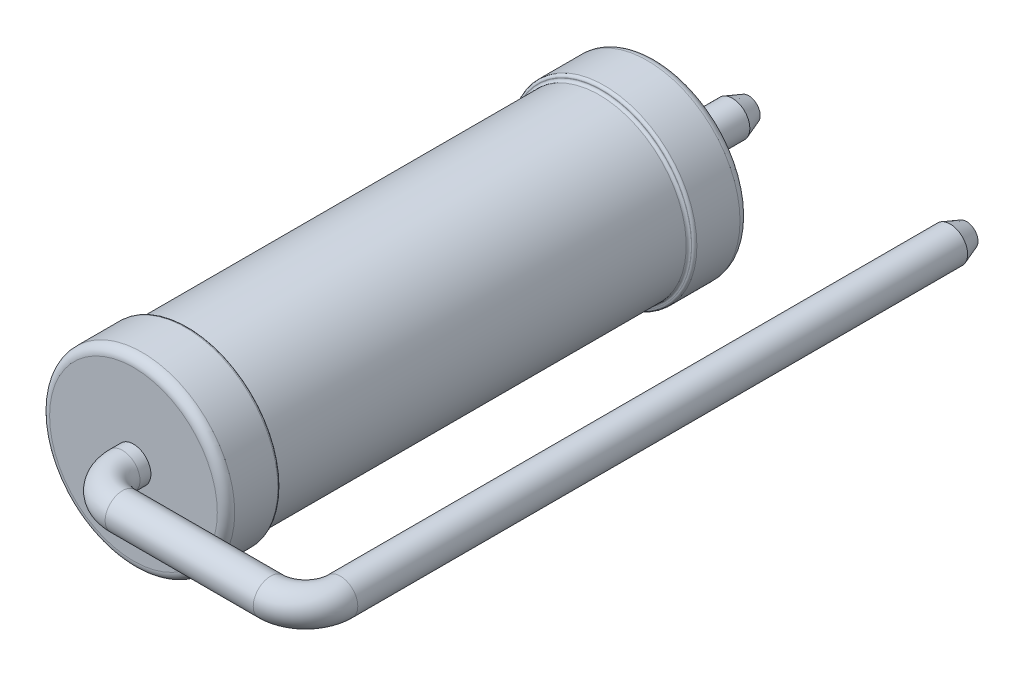
ISO-10303-21;
HEADER;
FILE_DESCRIPTION(('STEP AP214'),'2;1');
FILE_NAME('part.step','',(''),(''),'','','');
FILE_SCHEMA(('AUTOMOTIVE_DESIGN { 1 0 10303 214 1 1 1 1 }'));
ENDSEC;
DATA;
#1=APPLICATION_CONTEXT('core data for automotive mechanical design processes');
#2=APPLICATION_PROTOCOL_DEFINITION('international standard','automotive_design',2000,#1);
#3=PRODUCT_CONTEXT('',#1,'mechanical');
#4=PRODUCT('Part','Part','',(#3));
#5=PRODUCT_RELATED_PRODUCT_CATEGORY('part','',(#4));
#6=PRODUCT_DEFINITION_FORMATION('','',#4);
#7=PRODUCT_DEFINITION_CONTEXT('part definition',#1,'design');
#8=PRODUCT_DEFINITION('design','',#6,#7);
#9=PRODUCT_DEFINITION_SHAPE('','',#8);
#10=(LENGTH_UNIT() NAMED_UNIT(*) SI_UNIT(.MILLI.,.METRE.));
#11=(NAMED_UNIT(*) PLANE_ANGLE_UNIT() SI_UNIT($,.RADIAN.));
#12=(NAMED_UNIT(*) SI_UNIT($,.STERADIAN.) SOLID_ANGLE_UNIT());
#13=UNCERTAINTY_MEASURE_WITH_UNIT(LENGTH_MEASURE(1.E-05),#10,'distance_accuracy_value','');
#14=(GEOMETRIC_REPRESENTATION_CONTEXT(3) GLOBAL_UNCERTAINTY_ASSIGNED_CONTEXT((#13)) GLOBAL_UNIT_ASSIGNED_CONTEXT((#10,
#11,#12)) REPRESENTATION_CONTEXT('',''));
#15=CARTESIAN_POINT('',(0.,0.,0.));
#16=DIRECTION('',(0.,0.,1.));
#17=DIRECTION('',(1.,0.,0.));
#18=AXIS2_PLACEMENT_3D('',#15,#16,#17);
#19=CARTESIAN_POINT('',(-2.54,0.,12.446));
#20=DIRECTION('',(0.,0.,1.));
#21=DIRECTION('',(1.,0.,0.));
#22=AXIS2_PLACEMENT_3D('',#19,#20,#21);
#23=PLANE('',#22);
#24=CARTESIAN_POINT('',(-2.54,0.,12.446));
#25=DIRECTION('',(0.,0.,1.));
#26=DIRECTION('',(1.,0.,0.));
#27=AXIS2_PLACEMENT_3D('',#24,#25,#26);
#28=CIRCLE('',#27,0.4064);
#29=CARTESIAN_POINT('',(-2.1336,0.,12.446));
#30=VERTEX_POINT('',#29);
#31=EDGE_CURVE('E54',#30,#30,#28,.T.);
#32=ORIENTED_EDGE('',*,*,#31,.F.);
#33=EDGE_LOOP('',(#32));
#34=FACE_BOUND('',#33,.T.);
#35=CARTESIAN_POINT('',(-2.54,0.,12.446));
#36=DIRECTION('',(0.,0.,-1.));
#37=DIRECTION('',(-1.,0.,0.));
#38=AXIS2_PLACEMENT_3D('',#35,#36,#37);
#39=CIRCLE('',#38,1.9558);
#40=CARTESIAN_POINT('',(-4.4958,0.,12.446));
#41=VERTEX_POINT('',#40);
#42=EDGE_CURVE('E58',#41,#41,#39,.T.);
#43=ORIENTED_EDGE('',*,*,#42,.F.);
#44=EDGE_LOOP('',(#43));
#45=FACE_BOUND('',#44,.T.);
#46=ADVANCED_FACE('F34',(#34,#45),#23,.T.);
#47=CARTESIAN_POINT('',(-2.54,0.,12.2428));
#48=DIRECTION('',(0.,0.,-1.));
#49=DIRECTION('',(-1.,0.,0.));
#50=AXIS2_PLACEMENT_3D('',#47,#48,#49);
#51=TOROIDAL_SURFACE('',#50,1.9558,0.203200000000001);
#52=ORIENTED_EDGE('',*,*,#42,.T.);
#53=EDGE_LOOP('',(#52));
#54=FACE_BOUND('',#53,.T.);
#55=CARTESIAN_POINT('',(-2.54,0.,12.2428));
#56=DIRECTION('',(0.,0.,-1.));
#57=DIRECTION('',(-1.,0.,0.));
#58=AXIS2_PLACEMENT_3D('',#55,#56,#57);
#59=CIRCLE('',#58,2.159);
#60=CARTESIAN_POINT('',(-4.699,0.,12.2428));
#61=VERTEX_POINT('',#60);
#62=EDGE_CURVE('E62',#61,#61,#59,.T.);
#63=ORIENTED_EDGE('',*,*,#62,.F.);
#64=EDGE_LOOP('',(#63));
#65=FACE_BOUND('',#64,.T.);
#66=ADVANCED_FACE('F138',(#54,#65),#51,.T.);
#67=CARTESIAN_POINT('',(-2.54,0.,0.254));
#68=DIRECTION('',(0.,0.,-1.));
#69=DIRECTION('',(-1.,0.,0.));
#70=AXIS2_PLACEMENT_3D('',#67,#68,#69);
#71=CYLINDRICAL_SURFACE('',#70,2.159);
#72=ORIENTED_EDGE('',*,*,#62,.T.);
#73=EDGE_LOOP('',(#72));
#74=FACE_BOUND('',#73,.T.);
#75=CARTESIAN_POINT('',(-2.54,0.,11.23696));
#76=DIRECTION('',(0.,0.,-1.));
#77=DIRECTION('',(-1.,0.,0.));
#78=AXIS2_PLACEMENT_3D('',#75,#76,#77);
#79=CIRCLE('',#78,2.159);
#80=CARTESIAN_POINT('',(-4.699,0.,11.23696));
#81=VERTEX_POINT('',#80);
#82=EDGE_CURVE('E66',#81,#81,#79,.T.);
#83=ORIENTED_EDGE('',*,*,#82,.F.);
#84=EDGE_LOOP('',(#83));
#85=FACE_BOUND('',#84,.T.);
#86=ADVANCED_FACE('F144',(#74,#85),#71,.T.);
#87=CARTESIAN_POINT('',(-2.54,0.,11.23696));
#88=DIRECTION('',(0.,0.,-1.));
#89=DIRECTION('',(-1.,0.,0.));
#90=AXIS2_PLACEMENT_3D('',#87,#88,#89);
#91=TOROIDAL_SURFACE('',#90,2.09804,0.0609600000000001);
#92=ORIENTED_EDGE('',*,*,#82,.T.);
#93=EDGE_LOOP('',(#92));
#94=FACE_BOUND('',#93,.T.);
#95=CARTESIAN_POINT('',(-2.54,0.,11.176));
#96=DIRECTION('',(0.,0.,-1.));
#97=DIRECTION('',(-1.,0.,0.));
#98=AXIS2_PLACEMENT_3D('',#95,#96,#97);
#99=CIRCLE('',#98,2.09804);
#100=CARTESIAN_POINT('',(-4.63804,0.,11.176));
#101=VERTEX_POINT('',#100);
#102=EDGE_CURVE('E70',#101,#101,#99,.T.);
#103=ORIENTED_EDGE('',*,*,#102,.F.);
#104=EDGE_LOOP('',(#103));
#105=FACE_BOUND('',#104,.T.);
#106=ADVANCED_FACE('F323',(#94,#105),#91,.T.);
#107=CARTESIAN_POINT('',(-4.63804,0.,11.176));
#108=DIRECTION('',(0.,0.,-1.));
#109=DIRECTION('',(-1.,0.,0.));
#110=AXIS2_PLACEMENT_3D('',#107,#108,#109);
#111=PLANE('',#110);
#112=ORIENTED_EDGE('',*,*,#102,.T.);
#113=EDGE_LOOP('',(#112));
#114=FACE_BOUND('',#113,.T.);
#115=CARTESIAN_POINT('',(-2.54,0.,11.176));
#116=DIRECTION('',(0.,0.,-1.));
#117=DIRECTION('',(-1.,0.,0.));
#118=AXIS2_PLACEMENT_3D('',#115,#116,#117);
#119=CIRCLE('',#118,2.09296);
#120=CARTESIAN_POINT('',(-4.63296,0.,11.176));
#121=VERTEX_POINT('',#120);
#122=EDGE_CURVE('E74',#121,#121,#119,.T.);
#123=ORIENTED_EDGE('',*,*,#122,.F.);
#124=EDGE_LOOP('',(#123));
#125=FACE_BOUND('',#124,.T.);
#126=ADVANCED_FACE('F313',(#114,#125),#111,.T.);
#127=CARTESIAN_POINT('',(-2.54,0.,11.11504));
#128=DIRECTION('',(0.,0.,-1.));
#129=DIRECTION('',(-1.,0.,0.));
#130=AXIS2_PLACEMENT_3D('',#127,#128,#129);
#131=TOROIDAL_SURFACE('',#130,2.09296,0.060960000000001);
#132=ORIENTED_EDGE('',*,*,#122,.T.);
#133=EDGE_LOOP('',(#132));
#134=FACE_BOUND('',#133,.T.);
#135=CARTESIAN_POINT('',(-2.54,0.,11.11504));
#136=DIRECTION('',(0.,0.,-1.));
#137=DIRECTION('',(-1.,0.,0.));
#138=AXIS2_PLACEMENT_3D('',#135,#136,#137);
#139=CIRCLE('',#138,2.032);
#140=CARTESIAN_POINT('',(-4.572,0.,11.11504));
#141=VERTEX_POINT('',#140);
#142=EDGE_CURVE('E78',#141,#141,#139,.T.);
#143=ORIENTED_EDGE('',*,*,#142,.F.);
#144=EDGE_LOOP('',(#143));
#145=FACE_BOUND('',#144,.T.);
#146=ADVANCED_FACE('F303',(#134,#145),#131,.F.);
#147=CARTESIAN_POINT('',(-2.54,0.,0.254));
#148=DIRECTION('',(0.,0.,-1.));
#149=DIRECTION('',(-1.,0.,0.));
#150=AXIS2_PLACEMENT_3D('',#147,#148,#149);
#151=CYLINDRICAL_SURFACE('',#150,2.032);
#152=ORIENTED_EDGE('',*,*,#142,.T.);
#153=EDGE_LOOP('',(#152));
#154=FACE_BOUND('',#153,.T.);
#155=CARTESIAN_POINT('',(-2.54,0.,1.58496));
#156=DIRECTION('',(0.,0.,-1.));
#157=DIRECTION('',(-1.,0.,0.));
#158=AXIS2_PLACEMENT_3D('',#155,#156,#157);
#159=CIRCLE('',#158,2.032);
#160=CARTESIAN_POINT('',(-4.572,0.,1.58496));
#161=VERTEX_POINT('',#160);
#162=EDGE_CURVE('E82',#161,#161,#159,.T.);
#163=ORIENTED_EDGE('',*,*,#162,.F.);
#164=EDGE_LOOP('',(#163));
#165=FACE_BOUND('',#164,.T.);
#166=ADVANCED_FACE('F293',(#154,#165),#151,.T.);
#167=CARTESIAN_POINT('',(-2.54,0.,1.58496));
#168=DIRECTION('',(0.,0.,-1.));
#169=DIRECTION('',(-1.,0.,0.));
#170=AXIS2_PLACEMENT_3D('',#167,#168,#169);
#171=TOROIDAL_SURFACE('',#170,2.09296,0.0609599999999999);
#172=ORIENTED_EDGE('',*,*,#162,.T.);
#173=EDGE_LOOP('',(#172));
#174=FACE_BOUND('',#173,.T.);
#175=CARTESIAN_POINT('',(-2.54,0.,1.524));
#176=DIRECTION('',(0.,0.,-1.));
#177=DIRECTION('',(-1.,0.,0.));
#178=AXIS2_PLACEMENT_3D('',#175,#176,#177);
#179=CIRCLE('',#178,2.09296);
#180=CARTESIAN_POINT('',(-4.63296,0.,1.524));
#181=VERTEX_POINT('',#180);
#182=EDGE_CURVE('E85',#181,#181,#179,.T.);
#183=ORIENTED_EDGE('',*,*,#182,.F.);
#184=EDGE_LOOP('',(#183));
#185=FACE_BOUND('',#184,.T.);
#186=ADVANCED_FACE('F283',(#174,#185),#171,.F.);
#187=CARTESIAN_POINT('',(-4.63296,0.,1.524));
#188=DIRECTION('',(0.,0.,1.));
#189=DIRECTION('',(1.,0.,0.));
#190=AXIS2_PLACEMENT_3D('',#187,#188,#189);
#191=PLANE('',#190);
#192=ORIENTED_EDGE('',*,*,#182,.T.);
#193=EDGE_LOOP('',(#192));
#194=FACE_BOUND('',#193,.T.);
#195=CARTESIAN_POINT('',(-2.54,0.,1.524));
#196=DIRECTION('',(0.,0.,-1.));
#197=DIRECTION('',(-1.,0.,0.));
#198=AXIS2_PLACEMENT_3D('',#195,#196,#197);
#199=CIRCLE('',#198,2.09804);
#200=CARTESIAN_POINT('',(-4.63804,0.,1.524));
#201=VERTEX_POINT('',#200);
#202=EDGE_CURVE('E88',#201,#201,#199,.T.);
#203=ORIENTED_EDGE('',*,*,#202,.F.);
#204=EDGE_LOOP('',(#203));
#205=FACE_BOUND('',#204,.T.);
#206=ADVANCED_FACE('F273',(#194,#205),#191,.T.);
#207=CARTESIAN_POINT('',(-2.54,0.,1.46304));
#208=DIRECTION('',(0.,0.,-1.));
#209=DIRECTION('',(-1.,0.,0.));
#210=AXIS2_PLACEMENT_3D('',#207,#208,#209);
#211=TOROIDAL_SURFACE('',#210,2.09804,0.0609599999999999);
#212=ORIENTED_EDGE('',*,*,#202,.T.);
#213=EDGE_LOOP('',(#212));
#214=FACE_BOUND('',#213,.T.);
#215=CARTESIAN_POINT('',(-2.54,0.,1.46304));
#216=DIRECTION('',(0.,0.,-1.));
#217=DIRECTION('',(-1.,0.,0.));
#218=AXIS2_PLACEMENT_3D('',#215,#216,#217);
#219=CIRCLE('',#218,2.159);
#220=CARTESIAN_POINT('',(-4.699,0.,1.46304));
#221=VERTEX_POINT('',#220);
#222=EDGE_CURVE('E91',#221,#221,#219,.T.);
#223=ORIENTED_EDGE('',*,*,#222,.F.);
#224=EDGE_LOOP('',(#223));
#225=FACE_BOUND('',#224,.T.);
#226=ADVANCED_FACE('F263',(#214,#225),#211,.T.);
#227=CARTESIAN_POINT('',(-2.54,0.,0.254));
#228=DIRECTION('',(0.,0.,-1.));
#229=DIRECTION('',(-1.,0.,0.));
#230=AXIS2_PLACEMENT_3D('',#227,#228,#229);
#231=CYLINDRICAL_SURFACE('',#230,2.159);
#232=ORIENTED_EDGE('',*,*,#222,.T.);
#233=EDGE_LOOP('',(#232));
#234=FACE_BOUND('',#233,.T.);
#235=CARTESIAN_POINT('',(-2.54,0.,0.457200000000001));
#236=DIRECTION('',(0.,0.,-1.));
#237=DIRECTION('',(-1.,0.,0.));
#238=AXIS2_PLACEMENT_3D('',#235,#236,#237);
#239=CIRCLE('',#238,2.159);
#240=CARTESIAN_POINT('',(-4.699,0.,0.457200000000001));
#241=VERTEX_POINT('',#240);
#242=EDGE_CURVE('E94',#241,#241,#239,.T.);
#243=ORIENTED_EDGE('',*,*,#242,.F.);
#244=EDGE_LOOP('',(#243));
#245=FACE_BOUND('',#244,.T.);
#246=ADVANCED_FACE('F253',(#234,#245),#231,.T.);
#247=CARTESIAN_POINT('',(-2.54,0.,0.457200000000001));
#248=DIRECTION('',(0.,0.,-1.));
#249=DIRECTION('',(-1.,0.,0.));
#250=AXIS2_PLACEMENT_3D('',#247,#248,#249);
#251=TOROIDAL_SURFACE('',#250,1.9558,0.2032);
#252=ORIENTED_EDGE('',*,*,#242,.T.);
#253=EDGE_LOOP('',(#252));
#254=FACE_BOUND('',#253,.T.);
#255=CARTESIAN_POINT('',(-2.54,0.,0.254000000000001));
#256=DIRECTION('',(0.,0.,-1.));
#257=DIRECTION('',(-1.,0.,0.));
#258=AXIS2_PLACEMENT_3D('',#255,#256,#257);
#259=CIRCLE('',#258,1.9558);
#260=CARTESIAN_POINT('',(-4.4958,0.,0.254000000000001));
#261=VERTEX_POINT('',#260);
#262=EDGE_CURVE('E97',#261,#261,#259,.T.);
#263=ORIENTED_EDGE('',*,*,#262,.F.);
#264=EDGE_LOOP('',(#263));
#265=FACE_BOUND('',#264,.T.);
#266=ADVANCED_FACE('F237',(#254,#265),#251,.T.);
#267=CARTESIAN_POINT('',(-4.4958,0.,0.254000000000001));
#268=DIRECTION('',(0.,0.,-1.));
#269=DIRECTION('',(-1.,0.,0.));
#270=AXIS2_PLACEMENT_3D('',#267,#268,#269);
#271=PLANE('',#270);
#272=CARTESIAN_POINT('',(-2.54,0.,0.254000000000001));
#273=DIRECTION('',(0.,0.,-1.));
#274=DIRECTION('',(-1.,0.,0.));
#275=AXIS2_PLACEMENT_3D('',#272,#273,#274);
#276=CIRCLE('',#275,0.4064);
#277=CARTESIAN_POINT('',(-2.9464,0.,0.254000000000001));
#278=VERTEX_POINT('',#277);
#279=EDGE_CURVE('E55',#278,#278,#276,.T.);
#280=ORIENTED_EDGE('',*,*,#279,.F.);
#281=EDGE_LOOP('',(#280));
#282=FACE_BOUND('',#281,.T.);
#283=ORIENTED_EDGE('',*,*,#262,.T.);
#284=EDGE_LOOP('',(#283));
#285=FACE_BOUND('',#284,.T.);
#286=ADVANCED_FACE('F199',(#282,#285),#271,.T.);
#287=CARTESIAN_POINT('',(-2.54,0.,-1.905));
#288=DIRECTION('',(0.,0.,-1.));
#289=DIRECTION('',(-1.,0.,0.));
#290=AXIS2_PLACEMENT_3D('',#287,#288,#289);
#291=PLANE('',#290);
#292=CARTESIAN_POINT('',(-2.54,0.,-1.905));
#293=DIRECTION('',(0.,0.,-1.));
#294=DIRECTION('',(-1.,0.,0.));
#295=AXIS2_PLACEMENT_3D('',#292,#293,#294);
#296=CIRCLE('',#295,0.267727340744577);
#297=CARTESIAN_POINT('',(-2.80772734074458,0.,-1.905));
#298=VERTEX_POINT('',#297);
#299=EDGE_CURVE('E41',#298,#298,#296,.T.);
#300=ORIENTED_EDGE('',*,*,#299,.T.);
#301=EDGE_LOOP('',(#300));
#302=FACE_BOUND('',#301,.T.);
#303=ADVANCED_FACE('F188',(#302),#291,.T.);
#304=CARTESIAN_POINT('',(-2.54,0.,12.7));
#305=DIRECTION('',(0.,0.,-1.));
#306=DIRECTION('',(-1.,0.,0.));
#307=AXIS2_PLACEMENT_3D('',#304,#305,#306);
#308=CYLINDRICAL_SURFACE('',#307,0.4064);
#309=CARTESIAN_POINT('',(-2.54,0.,-1.524));
#310=DIRECTION('',(0.,0.,-1.));
#311=DIRECTION('',(-1.,0.,0.));
#312=AXIS2_PLACEMENT_3D('',#309,#310,#311);
#313=CIRCLE('',#312,0.4064);
#314=CARTESIAN_POINT('',(-2.9464,0.,-1.524));
#315=VERTEX_POINT('',#314);
#316=EDGE_CURVE('E10',#315,#315,#313,.F.);
#317=ORIENTED_EDGE('',*,*,#316,.T.);
#318=EDGE_LOOP('',(#317));
#319=FACE_BOUND('',#318,.T.);
#320=ORIENTED_EDGE('',*,*,#279,.T.);
#321=EDGE_LOOP('',(#320));
#322=FACE_BOUND('',#321,.T.);
#323=ADVANCED_FACE('F182',(#319,#322),#308,.T.);
#324=ORIENTED_EDGE('',*,*,#31,.T.);
#325=EDGE_LOOP('',(#324));
#326=FACE_BOUND('',#325,.T.);
#327=CARTESIAN_POINT('',(-2.54,0.,12.7));
#328=DIRECTION('',(0.,0.,-1.));
#329=DIRECTION('',(-1.,0.,0.));
#330=AXIS2_PLACEMENT_3D('',#327,#328,#329);
#331=CIRCLE('',#330,0.4064);
#332=CARTESIAN_POINT('',(-2.9464,0.,12.7));
#333=VERTEX_POINT('',#332);
#334=EDGE_CURVE('E100',#333,#333,#331,.T.);
#335=ORIENTED_EDGE('',*,*,#334,.T.);
#336=EDGE_LOOP('',(#335));
#337=FACE_BOUND('',#336,.T.);
#338=ADVANCED_FACE('F187',(#326,#337),#308,.T.);
#339=CARTESIAN_POINT('',(-1.7272,0.,12.7));
#340=DIRECTION('',(0.,-1.,0.));
#341=DIRECTION('',(0.,0.,-1.));
#342=AXIS2_PLACEMENT_3D('',#339,#340,#341);
#343=TOROIDAL_SURFACE('',#342,0.812799999999999,0.4064);
#344=CARTESIAN_POINT('',(-1.7272,0.,13.5128));
#345=DIRECTION('',(-1.,0.,0.));
#346=DIRECTION('',(0.,0.,1.));
#347=AXIS2_PLACEMENT_3D('',#344,#345,#346);
#348=CIRCLE('',#347,0.4064);
#349=CARTESIAN_POINT('',(-1.7272,0.,13.9192));
#350=VERTEX_POINT('',#349);
#351=EDGE_CURVE('E107',#350,#350,#348,.T.);
#352=CARTESIAN_POINT('',(-1.7272,0.,12.7));
#353=DIRECTION('',(0.,-1.,0.));
#354=DIRECTION('',(0.,0.,-1.));
#355=AXIS2_PLACEMENT_3D('',#352,#353,#354);
#356=CIRCLE('',#355,1.2192);
#357=EDGE_CURVE('',#350,#333,#356,.T.);
#358=ORIENTED_EDGE('',*,*,#351,.T.);
#359=ORIENTED_EDGE('',*,*,#334,.F.);
#360=ORIENTED_EDGE('',*,*,#357,.T.);
#361=ORIENTED_EDGE('',*,*,#357,.F.);
#362=EDGE_LOOP('',(#358,#360,#359,#361));
#363=FACE_BOUND('',#362,.T.);
#364=ADVANCED_FACE('F215',(#363),#343,.T.);
#365=CARTESIAN_POINT('',(1.7272,0.,13.5128));
#366=DIRECTION('',(-1.,0.,0.));
#367=DIRECTION('',(0.,0.,1.));
#368=AXIS2_PLACEMENT_3D('',#365,#366,#367);
#369=CYLINDRICAL_SURFACE('',#368,0.4064);
#370=CARTESIAN_POINT('',(1.7272,0.,13.5128));
#371=DIRECTION('',(-1.,0.,0.));
#372=DIRECTION('',(0.,0.,1.));
#373=AXIS2_PLACEMENT_3D('',#370,#371,#372);
#374=CIRCLE('',#373,0.4064);
#375=CARTESIAN_POINT('',(1.7272,0.,13.9192));
#376=VERTEX_POINT('',#375);
#377=EDGE_CURVE('E111',#376,#376,#374,.T.);
#378=ORIENTED_EDGE('',*,*,#377,.T.);
#379=EDGE_LOOP('',(#378));
#380=FACE_BOUND('',#379,.T.);
#381=ORIENTED_EDGE('',*,*,#351,.F.);
#382=EDGE_LOOP('',(#381));
#383=FACE_BOUND('',#382,.T.);
#384=ADVANCED_FACE('F135',(#380,#383),#369,.T.);
#385=CARTESIAN_POINT('',(1.7272,0.,12.7));
#386=DIRECTION('',(0.,-1.,0.));
#387=DIRECTION('',(0.,0.,-1.));
#388=AXIS2_PLACEMENT_3D('',#385,#386,#387);
#389=TOROIDAL_SURFACE('',#388,0.8128,0.4064);
#390=CARTESIAN_POINT('',(2.54,0.,12.7));
#391=DIRECTION('',(0.,0.,1.));
#392=DIRECTION('',(1.,0.,0.));
#393=AXIS2_PLACEMENT_3D('',#390,#391,#392);
#394=CIRCLE('',#393,0.4064);
#395=CARTESIAN_POINT('',(2.9464,0.,12.7));
#396=VERTEX_POINT('',#395);
#397=EDGE_CURVE('E115',#396,#396,#394,.T.);
#398=CARTESIAN_POINT('',(1.7272,0.,12.7));
#399=DIRECTION('',(0.,-1.,0.));
#400=DIRECTION('',(0.,0.,-1.));
#401=AXIS2_PLACEMENT_3D('',#398,#399,#400);
#402=CIRCLE('',#401,1.2192);
#403=EDGE_CURVE('',#396,#376,#402,.T.);
#404=ORIENTED_EDGE('',*,*,#397,.T.);
#405=ORIENTED_EDGE('',*,*,#377,.F.);
#406=ORIENTED_EDGE('',*,*,#403,.T.);
#407=ORIENTED_EDGE('',*,*,#403,.F.);
#408=EDGE_LOOP('',(#404,#406,#405,#407));
#409=FACE_BOUND('',#408,.T.);
#410=ADVANCED_FACE('F120',(#409),#389,.T.);
#411=CARTESIAN_POINT('',(2.54,0.,12.7));
#412=DIRECTION('',(0.,0.,-1.));
#413=DIRECTION('',(-1.,0.,0.));
#414=AXIS2_PLACEMENT_3D('',#411,#412,#413);
#415=CYLINDRICAL_SURFACE('',#414,0.4064);
#416=CARTESIAN_POINT('',(2.54,0.,-1.52399999999999));
#417=DIRECTION('',(0.,0.,1.));
#418=DIRECTION('',(1.,0.,0.));
#419=AXIS2_PLACEMENT_3D('',#416,#417,#418);
#420=CIRCLE('',#419,0.4064);
#421=CARTESIAN_POINT('',(2.9464,0.,-1.52399999999999));
#422=VERTEX_POINT('',#421);
#423=EDGE_CURVE('E49',#422,#422,#420,.T.);
#424=ORIENTED_EDGE('',*,*,#423,.T.);
#425=EDGE_LOOP('',(#424));
#426=FACE_BOUND('',#425,.T.);
#427=ORIENTED_EDGE('',*,*,#397,.F.);
#428=EDGE_LOOP('',(#427));
#429=FACE_BOUND('',#428,.T.);
#430=ADVANCED_FACE('F123',(#426,#429),#415,.T.);
#431=CARTESIAN_POINT('',(2.54,0.,-1.905));
#432=DIRECTION('',(0.,0.,1.));
#433=DIRECTION('',(1.,0.,0.));
#434=AXIS2_PLACEMENT_3D('',#431,#432,#433);
#435=PLANE('',#434);
#436=CARTESIAN_POINT('',(2.54,0.,-1.905));
#437=DIRECTION('',(0.,0.,1.));
#438=DIRECTION('',(1.,0.,0.));
#439=AXIS2_PLACEMENT_3D('',#436,#437,#438);
#440=CIRCLE('',#439,0.267727340744575);
#441=CARTESIAN_POINT('',(2.80772734074458,0.,-1.905));
#442=VERTEX_POINT('',#441);
#443=EDGE_CURVE('E45',#442,#442,#440,.F.);
#444=ORIENTED_EDGE('',*,*,#443,.T.);
#445=EDGE_LOOP('',(#444));
#446=FACE_BOUND('',#445,.T.);
#447=ADVANCED_FACE('F125',(#446),#435,.F.);
#448=CARTESIAN_POINT('',(2.54,0.,-1.52399999999999));
#449=DIRECTION('',(0.,0.,1.));
#450=DIRECTION('',(1.,0.,0.));
#451=AXIS2_PLACEMENT_3D('',#448,#449,#450);
#452=CONICAL_SURFACE('',#451,0.4064,0.349065850398864);
#453=ORIENTED_EDGE('',*,*,#443,.F.);
#454=EDGE_LOOP('',(#453));
#455=FACE_BOUND('',#454,.T.);
#456=ORIENTED_EDGE('',*,*,#423,.F.);
#457=EDGE_LOOP('',(#456));
#458=FACE_BOUND('',#457,.T.);
#459=ADVANCED_FACE('F132',(#455,#458),#452,.T.);
#460=CARTESIAN_POINT('',(-2.54,0.,-1.905));
#461=DIRECTION('',(0.,0.,1.));
#462=DIRECTION('',(1.,0.,0.));
#463=AXIS2_PLACEMENT_3D('',#460,#461,#462);
#464=CONICAL_SURFACE('',#463,0.267727340744577,0.349065850398863);
#465=ORIENTED_EDGE('',*,*,#316,.F.);
#466=EDGE_LOOP('',(#465));
#467=FACE_BOUND('',#466,.T.);
#468=ORIENTED_EDGE('',*,*,#299,.F.);
#469=EDGE_LOOP('',(#468));
#470=FACE_BOUND('',#469,.T.);
#471=ADVANCED_FACE('F36',(#467,#470),#464,.T.);
#472=CLOSED_SHELL('',(#46,#66,#86,#106,#126,#146,#166,#186,#206,#226,#246,#266,#286,#303,#323,
#338,#364,#384,#410,#430,#447,#459,#471));
#473=MANIFOLD_SOLID_BREP('B2',#472);
#474=ADVANCED_BREP_SHAPE_REPRESENTATION('',(#18,#473),#14);
#475=SHAPE_DEFINITION_REPRESENTATION(#9,#474);
ENDSEC;
END-ISO-10303-21;
